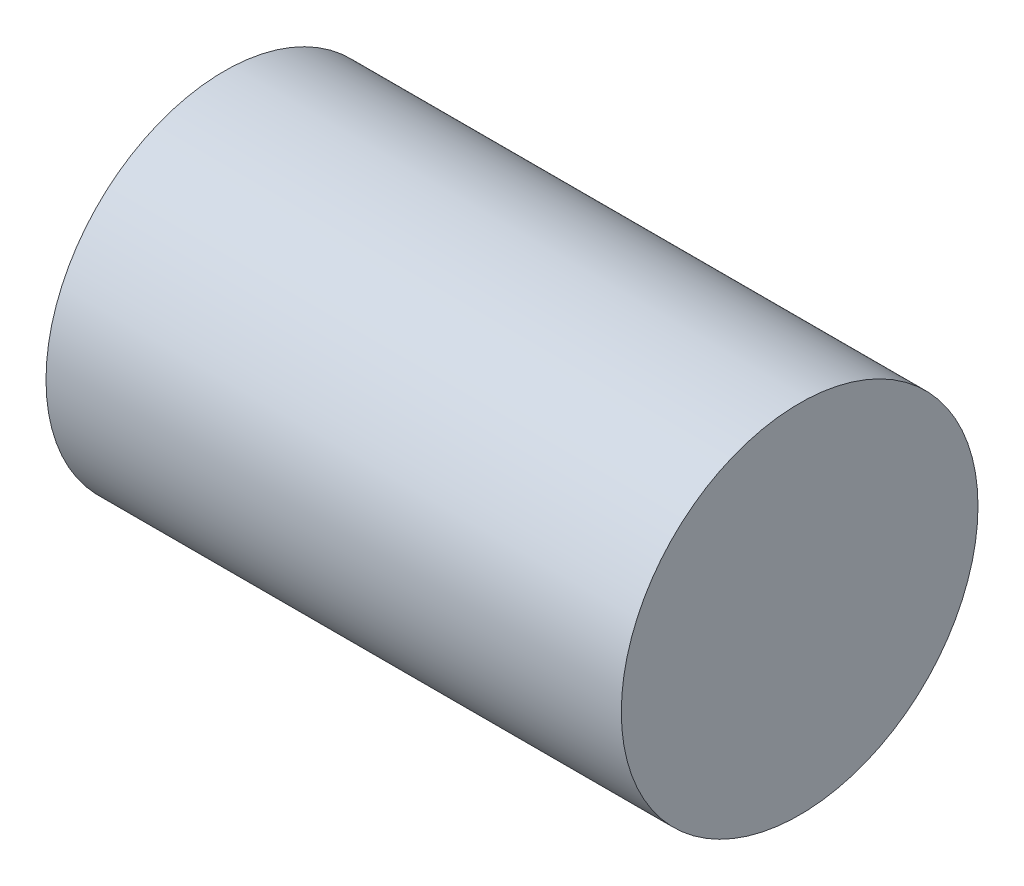
ISO-10303-21;
HEADER;
FILE_DESCRIPTION(('STEP AP214'),'2;1');
FILE_NAME('part.step','',(''),(''),'','','');
FILE_SCHEMA(('AUTOMOTIVE_DESIGN { 1 0 10303 214 1 1 1 1 }'));
ENDSEC;
DATA;
#1=APPLICATION_CONTEXT('core data for automotive mechanical design processes');
#2=APPLICATION_PROTOCOL_DEFINITION('international standard','automotive_design',2000,#1);
#3=PRODUCT_CONTEXT('',#1,'mechanical');
#4=PRODUCT('Part','Part','',(#3));
#5=PRODUCT_RELATED_PRODUCT_CATEGORY('part','',(#4));
#6=PRODUCT_DEFINITION_FORMATION('','',#4);
#7=PRODUCT_DEFINITION_CONTEXT('part definition',#1,'design');
#8=PRODUCT_DEFINITION('design','',#6,#7);
#9=PRODUCT_DEFINITION_SHAPE('','',#8);
#10=(LENGTH_UNIT() NAMED_UNIT(*) SI_UNIT(.MILLI.,.METRE.));
#11=(NAMED_UNIT(*) PLANE_ANGLE_UNIT() SI_UNIT($,.RADIAN.));
#12=(NAMED_UNIT(*) SI_UNIT($,.STERADIAN.) SOLID_ANGLE_UNIT());
#13=UNCERTAINTY_MEASURE_WITH_UNIT(LENGTH_MEASURE(1.E-05),#10,'distance_accuracy_value','');
#14=(GEOMETRIC_REPRESENTATION_CONTEXT(3) GLOBAL_UNCERTAINTY_ASSIGNED_CONTEXT((#13)) GLOBAL_UNIT_ASSIGNED_CONTEXT((#10,
#11,#12)) REPRESENTATION_CONTEXT('',''));
#15=CARTESIAN_POINT('',(0.,0.,0.));
#16=DIRECTION('',(0.,0.,1.));
#17=DIRECTION('',(1.,0.,0.));
#18=AXIS2_PLACEMENT_3D('',#15,#16,#17);
#19=CARTESIAN_POINT('',(0.,0.,0.));
#20=DIRECTION('',(1.,0.,0.));
#21=DIRECTION('',(0.,0.,-1.));
#22=AXIS2_PLACEMENT_3D('',#19,#20,#21);
#23=PLANE('',#22);
#24=CARTESIAN_POINT('',(0.,0.,0.));
#25=DIRECTION('',(-1.,0.,0.));
#26=DIRECTION('',(0.,0.,1.));
#27=AXIS2_PLACEMENT_3D('',#24,#25,#26);
#28=CIRCLE('',#27,5.);
#29=CARTESIAN_POINT('',(0.,0.,5.));
#30=VERTEX_POINT('',#29);
#31=EDGE_CURVE('E10',#30,#30,#28,.T.);
#32=ORIENTED_EDGE('',*,*,#31,.T.);
#33=EDGE_LOOP('',(#32));
#34=FACE_BOUND('',#33,.T.);
#35=ADVANCED_FACE('F31',(#34),#23,.F.);
#36=CARTESIAN_POINT('',(0.,0.,0.));
#37=DIRECTION('',(-1.,0.,0.));
#38=DIRECTION('',(0.,0.,1.));
#39=AXIS2_PLACEMENT_3D('',#36,#37,#38);
#40=CYLINDRICAL_SURFACE('',#39,5.);
#41=ORIENTED_EDGE('',*,*,#31,.F.);
#42=EDGE_LOOP('',(#41));
#43=FACE_BOUND('',#42,.T.);
#44=CARTESIAN_POINT('',(5.,0.,0.));
#45=DIRECTION('',(-1.,0.,0.));
#46=DIRECTION('',(0.,0.,1.));
#47=AXIS2_PLACEMENT_3D('',#44,#45,#46);
#48=CIRCLE('',#47,5.);
#49=CARTESIAN_POINT('',(5.,0.,5.));
#50=VERTEX_POINT('',#49);
#51=EDGE_CURVE('E37',#50,#50,#48,.T.);
#52=ORIENTED_EDGE('',*,*,#51,.T.);
#53=EDGE_LOOP('',(#52));
#54=FACE_BOUND('',#53,.T.);
#55=ADVANCED_FACE('F63',(#43,#54),#40,.T.);
#56=CARTESIAN_POINT('',(5.,5.,0.));
#57=DIRECTION('',(1.,0.,0.));
#58=DIRECTION('',(0.,0.,-1.));
#59=AXIS2_PLACEMENT_3D('',#56,#57,#58);
#60=PLANE('',#59);
#61=ORIENTED_EDGE('',*,*,#51,.F.);
#62=EDGE_LOOP('',(#61));
#63=FACE_BOUND('',#62,.T.);
#64=CARTESIAN_POINT('',(5.,0.,0.));
#65=DIRECTION('',(-1.,0.,0.));
#66=DIRECTION('',(0.,0.,1.));
#67=AXIS2_PLACEMENT_3D('',#64,#65,#66);
#68=CIRCLE('',#67,15.5);
#69=CARTESIAN_POINT('',(5.,0.,15.5));
#70=VERTEX_POINT('',#69);
#71=EDGE_CURVE('E41',#70,#70,#68,.T.);
#72=ORIENTED_EDGE('',*,*,#71,.T.);
#73=EDGE_LOOP('',(#72));
#74=FACE_BOUND('',#73,.T.);
#75=ADVANCED_FACE('F59',(#63,#74),#60,.F.);
#76=CARTESIAN_POINT('',(0.,0.,0.));
#77=DIRECTION('',(-1.,0.,0.));
#78=DIRECTION('',(0.,0.,1.));
#79=AXIS2_PLACEMENT_3D('',#76,#77,#78);
#80=CYLINDRICAL_SURFACE('',#79,15.5);
#81=ORIENTED_EDGE('',*,*,#71,.F.);
#82=EDGE_LOOP('',(#81));
#83=FACE_BOUND('',#82,.T.);
#84=CARTESIAN_POINT('',(55.,0.,0.));
#85=DIRECTION('',(-1.,0.,0.));
#86=DIRECTION('',(0.,0.,1.));
#87=AXIS2_PLACEMENT_3D('',#84,#85,#86);
#88=CIRCLE('',#87,15.5);
#89=CARTESIAN_POINT('',(55.,0.,15.5));
#90=VERTEX_POINT('',#89);
#91=EDGE_CURVE('E45',#90,#90,#88,.T.);
#92=ORIENTED_EDGE('',*,*,#91,.T.);
#93=EDGE_LOOP('',(#92));
#94=FACE_BOUND('',#93,.T.);
#95=ADVANCED_FACE('F51',(#83,#94),#80,.T.);
#96=CARTESIAN_POINT('',(55.,0.,0.));
#97=DIRECTION('',(-1.,0.,0.));
#98=DIRECTION('',(0.,0.,1.));
#99=AXIS2_PLACEMENT_3D('',#96,#97,#98);
#100=PLANE('',#99);
#101=ORIENTED_EDGE('',*,*,#91,.F.);
#102=EDGE_LOOP('',(#101));
#103=FACE_BOUND('',#102,.T.);
#104=ADVANCED_FACE('F53',(#103),#100,.F.);
#105=CLOSED_SHELL('',(#35,#55,#75,#95,#104));
#106=MANIFOLD_SOLID_BREP('B2',#105);
#107=ADVANCED_BREP_SHAPE_REPRESENTATION('',(#18,#106),#14);
#108=SHAPE_DEFINITION_REPRESENTATION(#9,#107);
ENDSEC;
END-ISO-10303-21;
